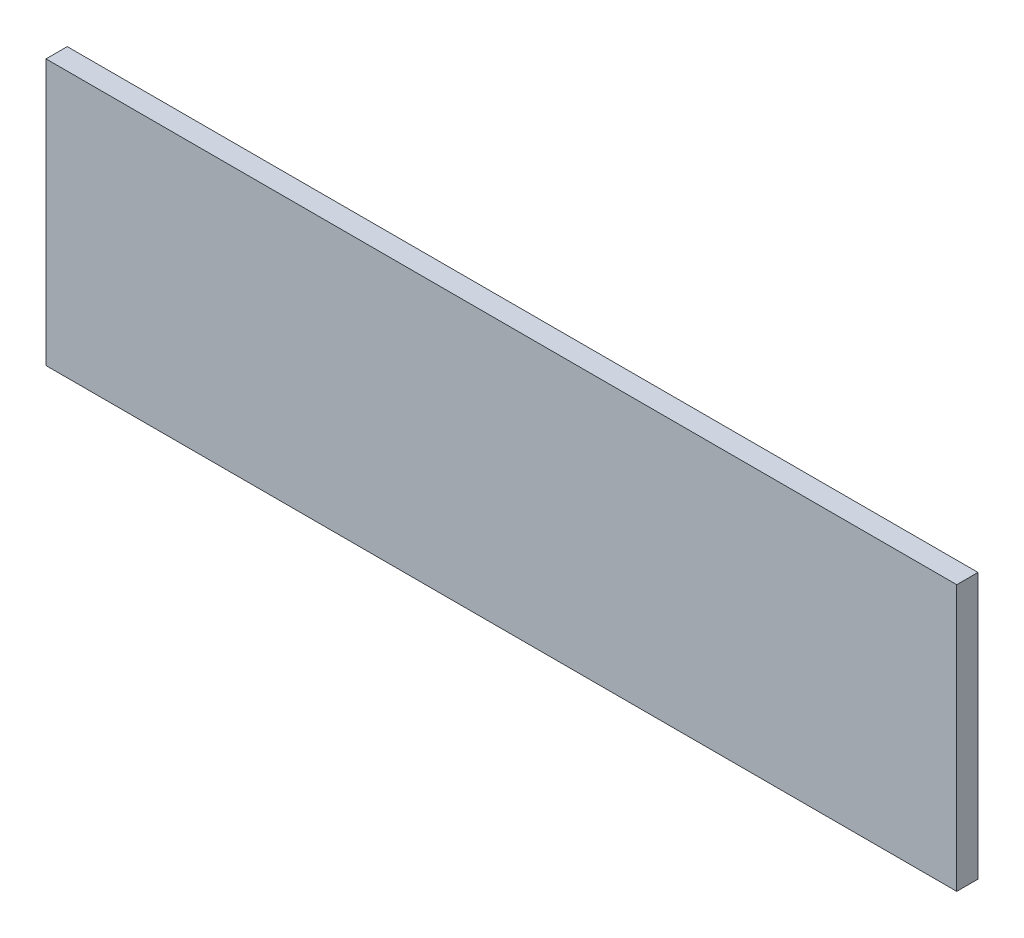
ISO-10303-21;
HEADER;
FILE_DESCRIPTION(('STEP AP214'),'2;1');
FILE_NAME('part.step','',(''),(''),'','','');
FILE_SCHEMA(('AUTOMOTIVE_DESIGN { 1 0 10303 214 1 1 1 1 }'));
ENDSEC;
DATA;
#1=APPLICATION_CONTEXT('core data for automotive mechanical design processes');
#2=APPLICATION_PROTOCOL_DEFINITION('international standard','automotive_design',2000,#1);
#3=PRODUCT_CONTEXT('',#1,'mechanical');
#4=PRODUCT('Part','Part','',(#3));
#5=PRODUCT_RELATED_PRODUCT_CATEGORY('part','',(#4));
#6=PRODUCT_DEFINITION_FORMATION('','',#4);
#7=PRODUCT_DEFINITION_CONTEXT('part definition',#1,'design');
#8=PRODUCT_DEFINITION('design','',#6,#7);
#9=PRODUCT_DEFINITION_SHAPE('','',#8);
#10=(LENGTH_UNIT() NAMED_UNIT(*) SI_UNIT(.MILLI.,.METRE.));
#11=(NAMED_UNIT(*) PLANE_ANGLE_UNIT() SI_UNIT($,.RADIAN.));
#12=(NAMED_UNIT(*) SI_UNIT($,.STERADIAN.) SOLID_ANGLE_UNIT());
#13=UNCERTAINTY_MEASURE_WITH_UNIT(LENGTH_MEASURE(1.E-05),#10,'distance_accuracy_value','');
#14=(GEOMETRIC_REPRESENTATION_CONTEXT(3) GLOBAL_UNCERTAINTY_ASSIGNED_CONTEXT((#13)) GLOBAL_UNIT_ASSIGNED_CONTEXT((#10,
#11,#12)) REPRESENTATION_CONTEXT('',''));
#15=CARTESIAN_POINT('',(0.,0.,0.));
#16=DIRECTION('',(0.,0.,1.));
#17=DIRECTION('',(1.,0.,0.));
#18=AXIS2_PLACEMENT_3D('',#15,#16,#17);
#19=CARTESIAN_POINT('',(304.8,-88.9,14.224));
#20=DIRECTION('',(-1.,0.,0.));
#21=DIRECTION('',(0.,0.,1.));
#22=AXIS2_PLACEMENT_3D('',#19,#20,#21);
#23=PLANE('',#22);
#24=DIRECTION('',(0.,1.,0.));
#25=VECTOR('',#24,1.);
#26=CARTESIAN_POINT('',(304.8,-88.9,0.));
#27=LINE('',#26,#25);
#28=CARTESIAN_POINT('',(304.8,-88.9,0.));
#29=VERTEX_POINT('',#28);
#30=CARTESIAN_POINT('',(304.8,88.9,0.));
#31=VERTEX_POINT('',#30);
#32=EDGE_CURVE('E107',#29,#31,#27,.T.);
#33=ORIENTED_EDGE('',*,*,#32,.T.);
#34=DIRECTION('',(0.,0.,-1.));
#35=VECTOR('',#34,1.);
#36=CARTESIAN_POINT('',(304.8,88.9,14.224));
#37=LINE('',#36,#35);
#38=CARTESIAN_POINT('',(304.8,88.9,14.224));
#39=VERTEX_POINT('',#38);
#40=EDGE_CURVE('E11',#39,#31,#37,.T.);
#41=ORIENTED_EDGE('',*,*,#40,.F.);
#42=DIRECTION('',(0.,1.,0.));
#43=VECTOR('',#42,1.);
#44=CARTESIAN_POINT('',(304.8,-88.9,14.224));
#45=LINE('',#44,#43);
#46=CARTESIAN_POINT('',(304.8,-88.9,14.224));
#47=VERTEX_POINT('',#46);
#48=EDGE_CURVE('E91',#47,#39,#45,.T.);
#49=ORIENTED_EDGE('',*,*,#48,.F.);
#50=DIRECTION('',(0.,0.,-1.));
#51=VECTOR('',#50,1.);
#52=CARTESIAN_POINT('',(304.8,-88.9,14.224));
#53=LINE('',#52,#51);
#54=EDGE_CURVE('E103',#47,#29,#53,.T.);
#55=ORIENTED_EDGE('',*,*,#54,.T.);
#56=EDGE_LOOP('',(#33,#41,#49,#55));
#57=FACE_BOUND('',#56,.T.);
#58=ADVANCED_FACE('F39',(#57),#23,.F.);
#59=CARTESIAN_POINT('',(-304.8,88.9,14.224));
#60=DIRECTION('',(0.,-1.,0.));
#61=DIRECTION('',(0.,0.,-1.));
#62=AXIS2_PLACEMENT_3D('',#59,#60,#61);
#63=PLANE('',#62);
#64=DIRECTION('',(-1.,0.,0.));
#65=VECTOR('',#64,1.);
#66=CARTESIAN_POINT('',(-304.8,88.9,0.));
#67=LINE('',#66,#65);
#68=CARTESIAN_POINT('',(-304.8,88.9,0.));
#69=VERTEX_POINT('',#68);
#70=EDGE_CURVE('E96',#31,#69,#67,.T.);
#71=ORIENTED_EDGE('',*,*,#70,.T.);
#72=DIRECTION('',(0.,0.,-1.));
#73=VECTOR('',#72,1.);
#74=CARTESIAN_POINT('',(-304.8,88.9,14.224));
#75=LINE('',#74,#73);
#76=CARTESIAN_POINT('',(-304.8,88.9,14.224));
#77=VERTEX_POINT('',#76);
#78=EDGE_CURVE('E48',#77,#69,#75,.T.);
#79=ORIENTED_EDGE('',*,*,#78,.F.);
#80=DIRECTION('',(-1.,0.,0.));
#81=VECTOR('',#80,1.);
#82=CARTESIAN_POINT('',(-304.8,88.9,14.224));
#83=LINE('',#82,#81);
#84=EDGE_CURVE('E86',#39,#77,#83,.T.);
#85=ORIENTED_EDGE('',*,*,#84,.F.);
#86=ORIENTED_EDGE('',*,*,#40,.T.);
#87=EDGE_LOOP('',(#71,#79,#85,#86));
#88=FACE_BOUND('',#87,.T.);
#89=ADVANCED_FACE('F95',(#88),#63,.F.);
#90=CARTESIAN_POINT('',(-304.8,-88.9,14.224));
#91=DIRECTION('',(1.,0.,0.));
#92=DIRECTION('',(0.,0.,-1.));
#93=AXIS2_PLACEMENT_3D('',#90,#91,#92);
#94=PLANE('',#93);
#95=DIRECTION('',(0.,-1.,0.));
#96=VECTOR('',#95,1.);
#97=CARTESIAN_POINT('',(-304.8,-88.9,0.));
#98=LINE('',#97,#96);
#99=CARTESIAN_POINT('',(-304.8,-88.9,0.));
#100=VERTEX_POINT('',#99);
#101=EDGE_CURVE('E73',#69,#100,#98,.T.);
#102=ORIENTED_EDGE('',*,*,#101,.T.);
#103=DIRECTION('',(0.,0.,-1.));
#104=VECTOR('',#103,1.);
#105=CARTESIAN_POINT('',(-304.8,-88.9,14.224));
#106=LINE('',#105,#104);
#107=CARTESIAN_POINT('',(-304.8,-88.9,14.224));
#108=VERTEX_POINT('',#107);
#109=EDGE_CURVE('E98',#108,#100,#106,.T.);
#110=ORIENTED_EDGE('',*,*,#109,.F.);
#111=DIRECTION('',(0.,-1.,0.));
#112=VECTOR('',#111,1.);
#113=CARTESIAN_POINT('',(-304.8,-88.9,14.224));
#114=LINE('',#113,#112);
#115=EDGE_CURVE('E89',#77,#108,#114,.T.);
#116=ORIENTED_EDGE('',*,*,#115,.F.);
#117=ORIENTED_EDGE('',*,*,#78,.T.);
#118=EDGE_LOOP('',(#102,#110,#116,#117));
#119=FACE_BOUND('',#118,.T.);
#120=ADVANCED_FACE('F99',(#119),#94,.F.);
#121=CARTESIAN_POINT('',(-304.8,-88.9,14.224));
#122=DIRECTION('',(0.,1.,0.));
#123=DIRECTION('',(0.,0.,1.));
#124=AXIS2_PLACEMENT_3D('',#121,#122,#123);
#125=PLANE('',#124);
#126=DIRECTION('',(1.,0.,0.));
#127=VECTOR('',#126,1.);
#128=CARTESIAN_POINT('',(-304.8,-88.9,0.));
#129=LINE('',#128,#127);
#130=EDGE_CURVE('E79',#100,#29,#129,.T.);
#131=ORIENTED_EDGE('',*,*,#130,.T.);
#132=ORIENTED_EDGE('',*,*,#54,.F.);
#133=DIRECTION('',(1.,0.,0.));
#134=VECTOR('',#133,1.);
#135=CARTESIAN_POINT('',(-304.8,-88.9,14.224));
#136=LINE('',#135,#134);
#137=EDGE_CURVE('E56',#108,#47,#136,.T.);
#138=ORIENTED_EDGE('',*,*,#137,.F.);
#139=ORIENTED_EDGE('',*,*,#109,.T.);
#140=EDGE_LOOP('',(#131,#132,#138,#139));
#141=FACE_BOUND('',#140,.T.);
#142=ADVANCED_FACE('F120',(#141),#125,.F.);
#143=CARTESIAN_POINT('',(0.,0.,14.224));
#144=DIRECTION('',(0.,0.,-1.));
#145=DIRECTION('',(-1.,0.,0.));
#146=AXIS2_PLACEMENT_3D('',#143,#144,#145);
#147=PLANE('',#146);
#148=ORIENTED_EDGE('',*,*,#48,.T.);
#149=ORIENTED_EDGE('',*,*,#84,.T.);
#150=ORIENTED_EDGE('',*,*,#115,.T.);
#151=ORIENTED_EDGE('',*,*,#137,.T.);
#152=EDGE_LOOP('',(#148,#149,#150,#151));
#153=FACE_BOUND('',#152,.T.);
#154=ADVANCED_FACE('F87',(#153),#147,.F.);
#155=CARTESIAN_POINT('',(0.,0.,0.));
#156=DIRECTION('',(0.,0.,-1.));
#157=DIRECTION('',(-1.,0.,0.));
#158=AXIS2_PLACEMENT_3D('',#155,#156,#157);
#159=PLANE('',#158);
#160=ORIENTED_EDGE('',*,*,#32,.F.);
#161=ORIENTED_EDGE('',*,*,#130,.F.);
#162=ORIENTED_EDGE('',*,*,#101,.F.);
#163=ORIENTED_EDGE('',*,*,#70,.F.);
#164=EDGE_LOOP('',(#160,#161,#162,#163));
#165=FACE_BOUND('',#164,.T.);
#166=ADVANCED_FACE('F123',(#165),#159,.T.);
#167=CLOSED_SHELL('',(#58,#89,#120,#142,#154,#166));
#168=MANIFOLD_SOLID_BREP('B2',#167);
#169=ADVANCED_BREP_SHAPE_REPRESENTATION('',(#18,#168),#14);
#170=SHAPE_DEFINITION_REPRESENTATION(#9,#169);
ENDSEC;
END-ISO-10303-21;
